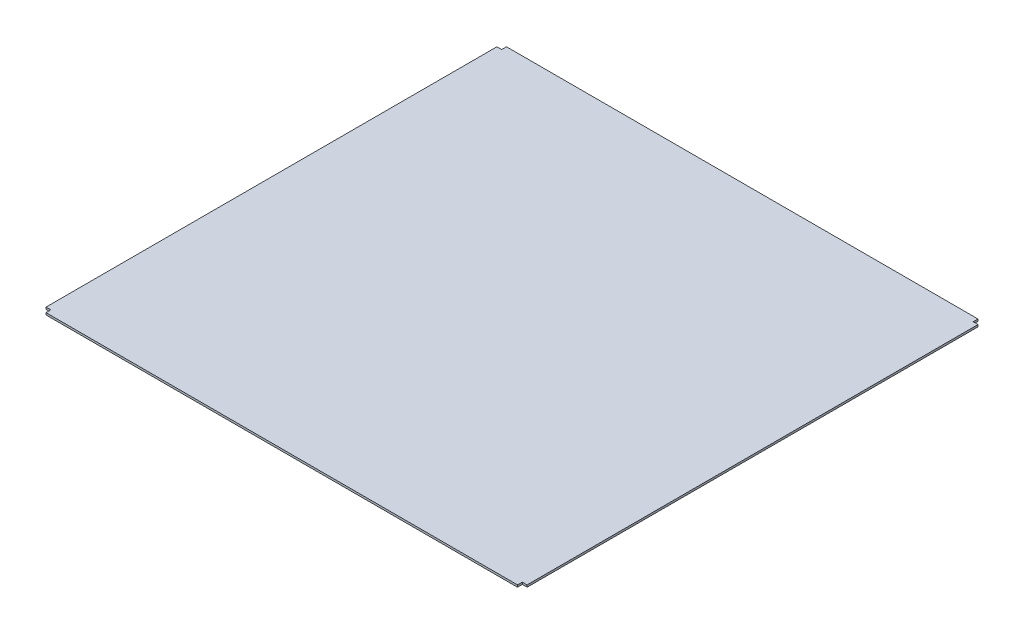
ISO-10303-21;
HEADER;
FILE_DESCRIPTION(('STEP AP214'),'2;1');
FILE_NAME('part.step','',(''),(''),'','','');
FILE_SCHEMA(('AUTOMOTIVE_DESIGN { 1 0 10303 214 1 1 1 1 }'));
ENDSEC;
DATA;
#1=APPLICATION_CONTEXT('core data for automotive mechanical design processes');
#2=APPLICATION_PROTOCOL_DEFINITION('international standard','automotive_design',2000,#1);
#3=PRODUCT_CONTEXT('',#1,'mechanical');
#4=PRODUCT('Part','Part','',(#3));
#5=PRODUCT_RELATED_PRODUCT_CATEGORY('part','',(#4));
#6=PRODUCT_DEFINITION_FORMATION('','',#4);
#7=PRODUCT_DEFINITION_CONTEXT('part definition',#1,'design');
#8=PRODUCT_DEFINITION('design','',#6,#7);
#9=PRODUCT_DEFINITION_SHAPE('','',#8);
#10=(LENGTH_UNIT() NAMED_UNIT(*) SI_UNIT(.MILLI.,.METRE.));
#11=(NAMED_UNIT(*) PLANE_ANGLE_UNIT() SI_UNIT($,.RADIAN.));
#12=(NAMED_UNIT(*) SI_UNIT($,.STERADIAN.) SOLID_ANGLE_UNIT());
#13=UNCERTAINTY_MEASURE_WITH_UNIT(LENGTH_MEASURE(1.E-05),#10,'distance_accuracy_value','');
#14=(GEOMETRIC_REPRESENTATION_CONTEXT(3) GLOBAL_UNCERTAINTY_ASSIGNED_CONTEXT((#13)) GLOBAL_UNIT_ASSIGNED_CONTEXT((#10,
#11,#12)) REPRESENTATION_CONTEXT('',''));
#15=CARTESIAN_POINT('',(0.,0.,0.));
#16=DIRECTION('',(0.,0.,1.));
#17=DIRECTION('',(1.,0.,0.));
#18=AXIS2_PLACEMENT_3D('',#15,#16,#17);
#19=CARTESIAN_POINT('',(281.221858435749,0.,-426.16202178041));
#20=DIRECTION('',(0.,1.,0.));
#21=DIRECTION('',(0.,0.,1.));
#22=AXIS2_PLACEMENT_3D('',#19,#20,#21);
#23=PLANE('',#22);
#24=DIRECTION('',(-1.,0.,0.));
#25=VECTOR('',#24,1.);
#26=CARTESIAN_POINT('',(624.221858435749,0.,-761.16202178041));
#27=LINE('',#26,#25);
#28=CARTESIAN_POINT('',(624.221858435749,0.,-761.16202178041));
#29=VERTEX_POINT('',#28);
#30=CARTESIAN_POINT('',(-61.778141564251,0.,-761.16202178041));
#31=VERTEX_POINT('',#30);
#32=EDGE_CURVE('E174',#29,#31,#27,.T.);
#33=ORIENTED_EDGE('',*,*,#32,.F.);
#34=DIRECTION('',(0.,0.,-1.));
#35=VECTOR('',#34,1.);
#36=CARTESIAN_POINT('',(624.221858435749,0.,-754.16202178041));
#37=LINE('',#36,#35);
#38=CARTESIAN_POINT('',(624.221858435749,0.,-754.16202178041));
#39=VERTEX_POINT('',#38);
#40=EDGE_CURVE('E169',#39,#29,#37,.T.);
#41=ORIENTED_EDGE('',*,*,#40,.F.);
#42=DIRECTION('',(-1.,0.,0.));
#43=VECTOR('',#42,1.);
#44=CARTESIAN_POINT('',(631.221858435749,0.,-754.16202178041));
#45=LINE('',#44,#43);
#46=CARTESIAN_POINT('',(631.221858435749,0.,-754.16202178041));
#47=VERTEX_POINT('',#46);
#48=EDGE_CURVE('E163',#47,#39,#45,.T.);
#49=ORIENTED_EDGE('',*,*,#48,.F.);
#50=DIRECTION('',(0.,0.,-1.));
#51=VECTOR('',#50,1.);
#52=CARTESIAN_POINT('',(631.221858435749,0.,-98.1620217804098));
#53=LINE('',#52,#51);
#54=CARTESIAN_POINT('',(631.221858435749,0.,-98.1620217804098));
#55=VERTEX_POINT('',#54);
#56=EDGE_CURVE('E157',#55,#47,#53,.T.);
#57=ORIENTED_EDGE('',*,*,#56,.F.);
#58=DIRECTION('',(1.,0.,0.));
#59=VECTOR('',#58,1.);
#60=CARTESIAN_POINT('',(624.221858435749,0.,-98.1620217804098));
#61=LINE('',#60,#59);
#62=CARTESIAN_POINT('',(624.221858435749,0.,-98.1620217804098));
#63=VERTEX_POINT('',#62);
#64=EDGE_CURVE('E151',#63,#55,#61,.T.);
#65=ORIENTED_EDGE('',*,*,#64,.F.);
#66=DIRECTION('',(0.,0.,-1.));
#67=VECTOR('',#66,1.);
#68=CARTESIAN_POINT('',(624.221858435749,0.,-91.1620217804098));
#69=LINE('',#68,#67);
#70=CARTESIAN_POINT('',(624.221858435749,0.,-91.1620217804098));
#71=VERTEX_POINT('',#70);
#72=EDGE_CURVE('E145',#71,#63,#69,.T.);
#73=ORIENTED_EDGE('',*,*,#72,.F.);
#74=DIRECTION('',(1.,0.,0.));
#75=VECTOR('',#74,1.);
#76=CARTESIAN_POINT('',(-61.778141564251,0.,-91.1620217804098));
#77=LINE('',#76,#75);
#78=CARTESIAN_POINT('',(-61.778141564251,0.,-91.1620217804098));
#79=VERTEX_POINT('',#78);
#80=EDGE_CURVE('E139',#79,#71,#77,.T.);
#81=ORIENTED_EDGE('',*,*,#80,.F.);
#82=DIRECTION('',(0.,0.,1.));
#83=VECTOR('',#82,1.);
#84=CARTESIAN_POINT('',(-61.778141564251,0.,-98.1620217804098));
#85=LINE('',#84,#83);
#86=CARTESIAN_POINT('',(-61.778141564251,0.,-98.1620217804098));
#87=VERTEX_POINT('',#86);
#88=EDGE_CURVE('E133',#87,#79,#85,.T.);
#89=ORIENTED_EDGE('',*,*,#88,.F.);
#90=DIRECTION('',(1.,0.,0.));
#91=VECTOR('',#90,1.);
#92=CARTESIAN_POINT('',(-68.778141564251,0.,-98.1620217804098));
#93=LINE('',#92,#91);
#94=CARTESIAN_POINT('',(-68.778141564251,0.,-98.1620217804098));
#95=VERTEX_POINT('',#94);
#96=EDGE_CURVE('E127',#95,#87,#93,.T.);
#97=ORIENTED_EDGE('',*,*,#96,.F.);
#98=DIRECTION('',(0.,0.,1.));
#99=VECTOR('',#98,1.);
#100=CARTESIAN_POINT('',(-68.778141564251,0.,-754.16202178041));
#101=LINE('',#100,#99);
#102=CARTESIAN_POINT('',(-68.778141564251,0.,-754.16202178041));
#103=VERTEX_POINT('',#102);
#104=EDGE_CURVE('E103',#103,#95,#101,.T.);
#105=ORIENTED_EDGE('',*,*,#104,.F.);
#106=DIRECTION('',(-1.,0.,0.));
#107=VECTOR('',#106,1.);
#108=CARTESIAN_POINT('',(-61.778141564251,0.,-754.16202178041));
#109=LINE('',#108,#107);
#110=CARTESIAN_POINT('',(-61.778141564251,0.,-754.16202178041));
#111=VERTEX_POINT('',#110);
#112=EDGE_CURVE('E105',#111,#103,#109,.T.);
#113=ORIENTED_EDGE('',*,*,#112,.F.);
#114=DIRECTION('',(0.,0.,1.));
#115=VECTOR('',#114,1.);
#116=CARTESIAN_POINT('',(-61.778141564251,0.,-761.16202178041));
#117=LINE('',#116,#115);
#118=EDGE_CURVE('E19',#31,#111,#117,.T.);
#119=ORIENTED_EDGE('',*,*,#118,.F.);
#120=EDGE_LOOP('',(#33,#41,#49,#57,#65,#73,#81,#89,#97,#105,#113,#119));
#121=FACE_BOUND('',#120,.T.);
#122=ADVANCED_FACE('F16',(#121),#23,.F.);
#123=CARTESIAN_POINT('',(-61.778141564251,0.,-761.16202178041));
#124=DIRECTION('',(-1.,0.,0.));
#125=DIRECTION('',(0.,0.,1.));
#126=AXIS2_PLACEMENT_3D('',#123,#124,#125);
#127=PLANE('',#126);
#128=DIRECTION('',(0.,0.,1.));
#129=VECTOR('',#128,1.);
#130=CARTESIAN_POINT('',(-61.778141564251,3.,-426.16202178041));
#131=LINE('',#130,#129);
#132=CARTESIAN_POINT('',(-61.778141564251,3.,-761.16202178041));
#133=VERTEX_POINT('',#132);
#134=CARTESIAN_POINT('',(-61.778141564251,3.,-754.16202178041));
#135=VERTEX_POINT('',#134);
#136=EDGE_CURVE('E178',#133,#135,#131,.T.);
#137=ORIENTED_EDGE('',*,*,#136,.F.);
#138=DIRECTION('',(0.,1.,0.));
#139=VECTOR('',#138,1.);
#140=CARTESIAN_POINT('',(-61.778141564251,0.,-761.16202178041));
#141=LINE('',#140,#139);
#142=EDGE_CURVE('E116',#31,#133,#141,.T.);
#143=ORIENTED_EDGE('',*,*,#142,.F.);
#144=ORIENTED_EDGE('',*,*,#118,.T.);
#145=DIRECTION('',(0.,1.,0.));
#146=VECTOR('',#145,1.);
#147=CARTESIAN_POINT('',(-61.778141564251,0.,-754.16202178041));
#148=LINE('',#147,#146);
#149=EDGE_CURVE('E111',#135,#111,#148,.F.);
#150=ORIENTED_EDGE('',*,*,#149,.F.);
#151=EDGE_LOOP('',(#137,#143,#144,#150));
#152=FACE_BOUND('',#151,.T.);
#153=ADVANCED_FACE('F113',(#152),#127,.T.);
#154=CARTESIAN_POINT('',(-61.778141564251,0.,-754.16202178041));
#155=DIRECTION('',(0.,0.,-1.));
#156=DIRECTION('',(-1.,0.,0.));
#157=AXIS2_PLACEMENT_3D('',#154,#155,#156);
#158=PLANE('',#157);
#159=DIRECTION('',(1.,0.,0.));
#160=VECTOR('',#159,1.);
#161=CARTESIAN_POINT('',(281.221858435749,3.,-754.16202178041));
#162=LINE('',#161,#160);
#163=CARTESIAN_POINT('',(-68.778141564251,3.,-754.16202178041));
#164=VERTEX_POINT('',#163);
#165=EDGE_CURVE('E120',#135,#164,#162,.F.);
#166=ORIENTED_EDGE('',*,*,#165,.F.);
#167=ORIENTED_EDGE('',*,*,#149,.T.);
#168=ORIENTED_EDGE('',*,*,#112,.T.);
#169=DIRECTION('',(0.,1.,0.));
#170=VECTOR('',#169,1.);
#171=CARTESIAN_POINT('',(-68.778141564251,0.,-754.16202178041));
#172=LINE('',#171,#170);
#173=EDGE_CURVE('E123',#164,#103,#172,.F.);
#174=ORIENTED_EDGE('',*,*,#173,.F.);
#175=EDGE_LOOP('',(#166,#167,#168,#174));
#176=FACE_BOUND('',#175,.T.);
#177=ADVANCED_FACE('F118',(#176),#158,.T.);
#178=CARTESIAN_POINT('',(-68.778141564251,0.,-754.16202178041));
#179=DIRECTION('',(-1.,0.,0.));
#180=DIRECTION('',(0.,0.,1.));
#181=AXIS2_PLACEMENT_3D('',#178,#179,#180);
#182=PLANE('',#181);
#183=DIRECTION('',(0.,0.,1.));
#184=VECTOR('',#183,1.);
#185=CARTESIAN_POINT('',(-68.778141564251,3.,-426.16202178041));
#186=LINE('',#185,#184);
#187=CARTESIAN_POINT('',(-68.778141564251,3.,-98.1620217804098));
#188=VERTEX_POINT('',#187);
#189=EDGE_CURVE('E181',#164,#188,#186,.T.);
#190=ORIENTED_EDGE('',*,*,#189,.F.);
#191=ORIENTED_EDGE('',*,*,#173,.T.);
#192=ORIENTED_EDGE('',*,*,#104,.T.);
#193=DIRECTION('',(0.,1.,0.));
#194=VECTOR('',#193,1.);
#195=CARTESIAN_POINT('',(-68.778141564251,0.,-98.1620217804098));
#196=LINE('',#195,#194);
#197=EDGE_CURVE('E130',#188,#95,#196,.F.);
#198=ORIENTED_EDGE('',*,*,#197,.F.);
#199=EDGE_LOOP('',(#190,#191,#192,#198));
#200=FACE_BOUND('',#199,.T.);
#201=ADVANCED_FACE('F232',(#200),#182,.T.);
#202=CARTESIAN_POINT('',(-68.778141564251,0.,-98.1620217804098));
#203=DIRECTION('',(0.,0.,1.));
#204=DIRECTION('',(1.,0.,0.));
#205=AXIS2_PLACEMENT_3D('',#202,#203,#204);
#206=PLANE('',#205);
#207=DIRECTION('',(1.,0.,0.));
#208=VECTOR('',#207,1.);
#209=CARTESIAN_POINT('',(281.221858435749,3.,-98.1620217804098));
#210=LINE('',#209,#208);
#211=CARTESIAN_POINT('',(-61.778141564251,3.,-98.1620217804098));
#212=VERTEX_POINT('',#211);
#213=EDGE_CURVE('E184',#188,#212,#210,.T.);
#214=ORIENTED_EDGE('',*,*,#213,.F.);
#215=ORIENTED_EDGE('',*,*,#197,.T.);
#216=ORIENTED_EDGE('',*,*,#96,.T.);
#217=DIRECTION('',(0.,1.,0.));
#218=VECTOR('',#217,1.);
#219=CARTESIAN_POINT('',(-61.778141564251,0.,-98.1620217804098));
#220=LINE('',#219,#218);
#221=EDGE_CURVE('E136',#212,#87,#220,.F.);
#222=ORIENTED_EDGE('',*,*,#221,.F.);
#223=EDGE_LOOP('',(#214,#215,#216,#222));
#224=FACE_BOUND('',#223,.T.);
#225=ADVANCED_FACE('F229',(#224),#206,.T.);
#226=CARTESIAN_POINT('',(-61.778141564251,0.,-98.1620217804098));
#227=DIRECTION('',(-1.,0.,0.));
#228=DIRECTION('',(0.,0.,1.));
#229=AXIS2_PLACEMENT_3D('',#226,#227,#228);
#230=PLANE('',#229);
#231=DIRECTION('',(0.,0.,1.));
#232=VECTOR('',#231,1.);
#233=CARTESIAN_POINT('',(-61.778141564251,3.,-426.16202178041));
#234=LINE('',#233,#232);
#235=CARTESIAN_POINT('',(-61.778141564251,3.,-91.1620217804098));
#236=VERTEX_POINT('',#235);
#237=EDGE_CURVE('E187',#212,#236,#234,.T.);
#238=ORIENTED_EDGE('',*,*,#237,.F.);
#239=ORIENTED_EDGE('',*,*,#221,.T.);
#240=ORIENTED_EDGE('',*,*,#88,.T.);
#241=DIRECTION('',(0.,1.,0.));
#242=VECTOR('',#241,1.);
#243=CARTESIAN_POINT('',(-61.778141564251,0.,-91.1620217804098));
#244=LINE('',#243,#242);
#245=EDGE_CURVE('E142',#236,#79,#244,.F.);
#246=ORIENTED_EDGE('',*,*,#245,.F.);
#247=EDGE_LOOP('',(#238,#239,#240,#246));
#248=FACE_BOUND('',#247,.T.);
#249=ADVANCED_FACE('F226',(#248),#230,.T.);
#250=CARTESIAN_POINT('',(-61.778141564251,0.,-91.1620217804098));
#251=DIRECTION('',(0.,0.,1.));
#252=DIRECTION('',(1.,0.,0.));
#253=AXIS2_PLACEMENT_3D('',#250,#251,#252);
#254=PLANE('',#253);
#255=DIRECTION('',(1.,0.,0.));
#256=VECTOR('',#255,1.);
#257=CARTESIAN_POINT('',(281.221858435749,3.,-91.1620217804098));
#258=LINE('',#257,#256);
#259=CARTESIAN_POINT('',(624.221858435749,3.,-91.1620217804098));
#260=VERTEX_POINT('',#259);
#261=EDGE_CURVE('E190',#236,#260,#258,.T.);
#262=ORIENTED_EDGE('',*,*,#261,.F.);
#263=ORIENTED_EDGE('',*,*,#245,.T.);
#264=ORIENTED_EDGE('',*,*,#80,.T.);
#265=DIRECTION('',(0.,1.,0.));
#266=VECTOR('',#265,1.);
#267=CARTESIAN_POINT('',(624.221858435749,0.,-91.1620217804098));
#268=LINE('',#267,#266);
#269=EDGE_CURVE('E148',#260,#71,#268,.F.);
#270=ORIENTED_EDGE('',*,*,#269,.F.);
#271=EDGE_LOOP('',(#262,#263,#264,#270));
#272=FACE_BOUND('',#271,.T.);
#273=ADVANCED_FACE('F223',(#272),#254,.T.);
#274=CARTESIAN_POINT('',(624.221858435749,0.,-91.1620217804098));
#275=DIRECTION('',(1.,0.,0.));
#276=DIRECTION('',(0.,0.,-1.));
#277=AXIS2_PLACEMENT_3D('',#274,#275,#276);
#278=PLANE('',#277);
#279=DIRECTION('',(0.,0.,1.));
#280=VECTOR('',#279,1.);
#281=CARTESIAN_POINT('',(624.221858435749,3.,-426.16202178041));
#282=LINE('',#281,#280);
#283=CARTESIAN_POINT('',(624.221858435749,3.,-98.1620217804098));
#284=VERTEX_POINT('',#283);
#285=EDGE_CURVE('E193',#260,#284,#282,.F.);
#286=ORIENTED_EDGE('',*,*,#285,.F.);
#287=ORIENTED_EDGE('',*,*,#269,.T.);
#288=ORIENTED_EDGE('',*,*,#72,.T.);
#289=DIRECTION('',(0.,1.,0.));
#290=VECTOR('',#289,1.);
#291=CARTESIAN_POINT('',(624.221858435749,0.,-98.1620217804098));
#292=LINE('',#291,#290);
#293=EDGE_CURVE('E154',#284,#63,#292,.F.);
#294=ORIENTED_EDGE('',*,*,#293,.F.);
#295=EDGE_LOOP('',(#286,#287,#288,#294));
#296=FACE_BOUND('',#295,.T.);
#297=ADVANCED_FACE('F220',(#296),#278,.T.);
#298=CARTESIAN_POINT('',(624.221858435749,0.,-98.1620217804098));
#299=DIRECTION('',(0.,0.,1.));
#300=DIRECTION('',(1.,0.,0.));
#301=AXIS2_PLACEMENT_3D('',#298,#299,#300);
#302=PLANE('',#301);
#303=DIRECTION('',(1.,0.,0.));
#304=VECTOR('',#303,1.);
#305=CARTESIAN_POINT('',(281.221858435749,3.,-98.1620217804098));
#306=LINE('',#305,#304);
#307=CARTESIAN_POINT('',(631.221858435749,3.,-98.1620217804098));
#308=VERTEX_POINT('',#307);
#309=EDGE_CURVE('E196',#284,#308,#306,.T.);
#310=ORIENTED_EDGE('',*,*,#309,.F.);
#311=ORIENTED_EDGE('',*,*,#293,.T.);
#312=ORIENTED_EDGE('',*,*,#64,.T.);
#313=DIRECTION('',(0.,1.,0.));
#314=VECTOR('',#313,1.);
#315=CARTESIAN_POINT('',(631.221858435749,0.,-98.1620217804098));
#316=LINE('',#315,#314);
#317=EDGE_CURVE('E160',#308,#55,#316,.F.);
#318=ORIENTED_EDGE('',*,*,#317,.F.);
#319=EDGE_LOOP('',(#310,#311,#312,#318));
#320=FACE_BOUND('',#319,.T.);
#321=ADVANCED_FACE('F217',(#320),#302,.T.);
#322=CARTESIAN_POINT('',(631.221858435749,0.,-98.1620217804098));
#323=DIRECTION('',(1.,0.,0.));
#324=DIRECTION('',(0.,0.,-1.));
#325=AXIS2_PLACEMENT_3D('',#322,#323,#324);
#326=PLANE('',#325);
#327=DIRECTION('',(0.,0.,1.));
#328=VECTOR('',#327,1.);
#329=CARTESIAN_POINT('',(631.221858435749,3.,-426.16202178041));
#330=LINE('',#329,#328);
#331=CARTESIAN_POINT('',(631.221858435749,3.,-754.16202178041));
#332=VERTEX_POINT('',#331);
#333=EDGE_CURVE('E199',#308,#332,#330,.F.);
#334=ORIENTED_EDGE('',*,*,#333,.F.);
#335=ORIENTED_EDGE('',*,*,#317,.T.);
#336=ORIENTED_EDGE('',*,*,#56,.T.);
#337=DIRECTION('',(0.,1.,0.));
#338=VECTOR('',#337,1.);
#339=CARTESIAN_POINT('',(631.221858435749,0.,-754.16202178041));
#340=LINE('',#339,#338);
#341=EDGE_CURVE('E166',#332,#47,#340,.F.);
#342=ORIENTED_EDGE('',*,*,#341,.F.);
#343=EDGE_LOOP('',(#334,#335,#336,#342));
#344=FACE_BOUND('',#343,.T.);
#345=ADVANCED_FACE('F214',(#344),#326,.T.);
#346=CARTESIAN_POINT('',(631.221858435749,0.,-754.16202178041));
#347=DIRECTION('',(0.,0.,-1.));
#348=DIRECTION('',(-1.,0.,0.));
#349=AXIS2_PLACEMENT_3D('',#346,#347,#348);
#350=PLANE('',#349);
#351=DIRECTION('',(1.,0.,0.));
#352=VECTOR('',#351,1.);
#353=CARTESIAN_POINT('',(281.221858435749,3.,-754.16202178041));
#354=LINE('',#353,#352);
#355=CARTESIAN_POINT('',(624.221858435749,3.,-754.16202178041));
#356=VERTEX_POINT('',#355);
#357=EDGE_CURVE('E202',#332,#356,#354,.F.);
#358=ORIENTED_EDGE('',*,*,#357,.F.);
#359=ORIENTED_EDGE('',*,*,#341,.T.);
#360=ORIENTED_EDGE('',*,*,#48,.T.);
#361=DIRECTION('',(0.,1.,0.));
#362=VECTOR('',#361,1.);
#363=CARTESIAN_POINT('',(624.221858435749,0.,-754.16202178041));
#364=LINE('',#363,#362);
#365=EDGE_CURVE('E171',#356,#39,#364,.F.);
#366=ORIENTED_EDGE('',*,*,#365,.F.);
#367=EDGE_LOOP('',(#358,#359,#360,#366));
#368=FACE_BOUND('',#367,.T.);
#369=ADVANCED_FACE('F211',(#368),#350,.T.);
#370=CARTESIAN_POINT('',(624.221858435749,0.,-754.16202178041));
#371=DIRECTION('',(1.,0.,0.));
#372=DIRECTION('',(0.,0.,-1.));
#373=AXIS2_PLACEMENT_3D('',#370,#371,#372);
#374=PLANE('',#373);
#375=DIRECTION('',(0.,0.,1.));
#376=VECTOR('',#375,1.);
#377=CARTESIAN_POINT('',(624.221858435749,3.,-426.16202178041));
#378=LINE('',#377,#376);
#379=CARTESIAN_POINT('',(624.221858435749,3.,-761.16202178041));
#380=VERTEX_POINT('',#379);
#381=EDGE_CURVE('E25',#356,#380,#378,.F.);
#382=ORIENTED_EDGE('',*,*,#381,.F.);
#383=ORIENTED_EDGE('',*,*,#365,.T.);
#384=ORIENTED_EDGE('',*,*,#40,.T.);
#385=DIRECTION('',(0.,1.,0.));
#386=VECTOR('',#385,1.);
#387=CARTESIAN_POINT('',(624.221858435749,0.,-761.16202178041));
#388=LINE('',#387,#386);
#389=EDGE_CURVE('E34',#380,#29,#388,.F.);
#390=ORIENTED_EDGE('',*,*,#389,.F.);
#391=EDGE_LOOP('',(#382,#383,#384,#390));
#392=FACE_BOUND('',#391,.T.);
#393=ADVANCED_FACE('F209',(#392),#374,.T.);
#394=CARTESIAN_POINT('',(624.221858435749,0.,-761.16202178041));
#395=DIRECTION('',(0.,0.,-1.));
#396=DIRECTION('',(-1.,0.,0.));
#397=AXIS2_PLACEMENT_3D('',#394,#395,#396);
#398=PLANE('',#397);
#399=DIRECTION('',(1.,0.,0.));
#400=VECTOR('',#399,1.);
#401=CARTESIAN_POINT('',(281.221858435749,3.,-761.16202178041));
#402=LINE('',#401,#400);
#403=EDGE_CURVE('E11',#380,#133,#402,.F.);
#404=ORIENTED_EDGE('',*,*,#403,.F.);
#405=ORIENTED_EDGE('',*,*,#389,.T.);
#406=ORIENTED_EDGE('',*,*,#32,.T.);
#407=ORIENTED_EDGE('',*,*,#142,.T.);
#408=EDGE_LOOP('',(#404,#405,#406,#407));
#409=FACE_BOUND('',#408,.T.);
#410=ADVANCED_FACE('F234',(#409),#398,.T.);
#411=CARTESIAN_POINT('',(281.221858435749,3.,-426.16202178041));
#412=DIRECTION('',(0.,1.,0.));
#413=DIRECTION('',(0.,0.,1.));
#414=AXIS2_PLACEMENT_3D('',#411,#412,#413);
#415=PLANE('',#414);
#416=ORIENTED_EDGE('',*,*,#381,.T.);
#417=ORIENTED_EDGE('',*,*,#403,.T.);
#418=ORIENTED_EDGE('',*,*,#136,.T.);
#419=ORIENTED_EDGE('',*,*,#165,.T.);
#420=ORIENTED_EDGE('',*,*,#189,.T.);
#421=ORIENTED_EDGE('',*,*,#213,.T.);
#422=ORIENTED_EDGE('',*,*,#237,.T.);
#423=ORIENTED_EDGE('',*,*,#261,.T.);
#424=ORIENTED_EDGE('',*,*,#285,.T.);
#425=ORIENTED_EDGE('',*,*,#309,.T.);
#426=ORIENTED_EDGE('',*,*,#333,.T.);
#427=ORIENTED_EDGE('',*,*,#357,.T.);
#428=EDGE_LOOP('',(#416,#417,#418,#419,#420,#421,#422,#423,#424,#425,#426,#427));
#429=FACE_BOUND('',#428,.T.);
#430=ADVANCED_FACE('F207',(#429),#415,.T.);
#431=CLOSED_SHELL('',(#122,#153,#177,#201,#225,#249,#273,#297,#321,#345,#369,#393,#410,#430));
#432=MANIFOLD_SOLID_BREP('B1',#431);
#433=ADVANCED_BREP_SHAPE_REPRESENTATION('',(#18,#432),#14);
#434=SHAPE_DEFINITION_REPRESENTATION(#9,#433);
ENDSEC;
END-ISO-10303-21;
